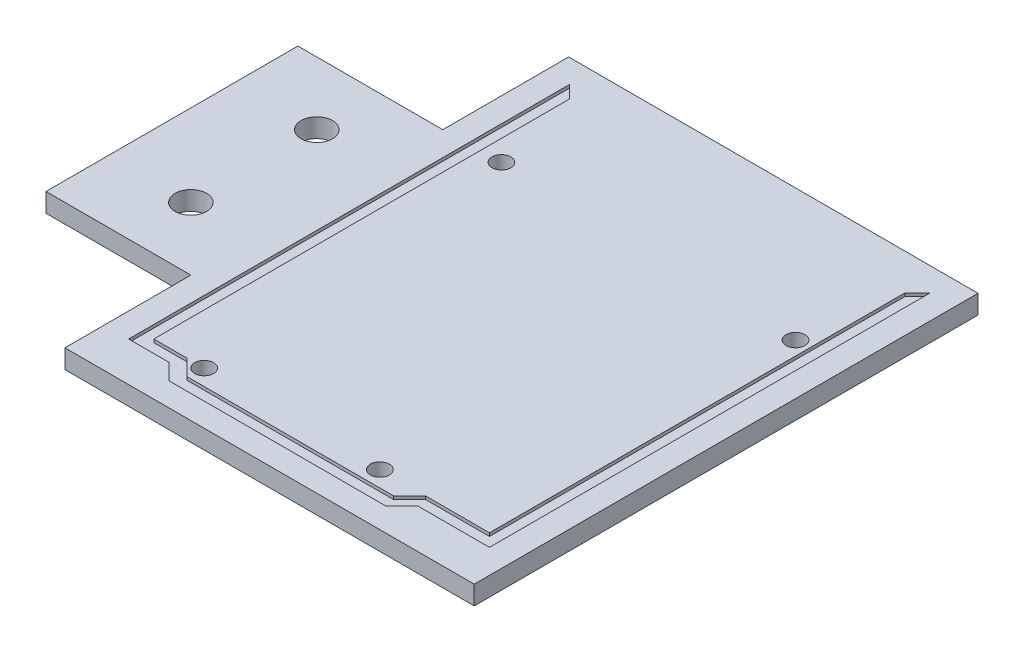
ISO-10303-21;
HEADER;
FILE_DESCRIPTION(('STEP AP214'),'2;1');
FILE_NAME('part.step','',(''),(''),'','','');
FILE_SCHEMA(('AUTOMOTIVE_DESIGN { 1 0 10303 214 1 1 1 1 }'));
ENDSEC;
DATA;
#1=APPLICATION_CONTEXT('core data for automotive mechanical design processes');
#2=APPLICATION_PROTOCOL_DEFINITION('international standard','automotive_design',2000,#1);
#3=PRODUCT_CONTEXT('',#1,'mechanical');
#4=PRODUCT('Part','Part','',(#3));
#5=PRODUCT_RELATED_PRODUCT_CATEGORY('part','',(#4));
#6=PRODUCT_DEFINITION_FORMATION('','',#4);
#7=PRODUCT_DEFINITION_CONTEXT('part definition',#1,'design');
#8=PRODUCT_DEFINITION('design','',#6,#7);
#9=PRODUCT_DEFINITION_SHAPE('','',#8);
#10=(LENGTH_UNIT() NAMED_UNIT(*) SI_UNIT(.MILLI.,.METRE.));
#11=(NAMED_UNIT(*) PLANE_ANGLE_UNIT() SI_UNIT($,.RADIAN.));
#12=(NAMED_UNIT(*) SI_UNIT($,.STERADIAN.) SOLID_ANGLE_UNIT());
#13=UNCERTAINTY_MEASURE_WITH_UNIT(LENGTH_MEASURE(1.E-05),#10,'distance_accuracy_value','');
#14=(GEOMETRIC_REPRESENTATION_CONTEXT(3) GLOBAL_UNCERTAINTY_ASSIGNED_CONTEXT((#13)) GLOBAL_UNIT_ASSIGNED_CONTEXT((#10,
#11,#12)) REPRESENTATION_CONTEXT('',''));
#15=CARTESIAN_POINT('',(0.,0.,0.));
#16=DIRECTION('',(0.,0.,1.));
#17=DIRECTION('',(1.,0.,0.));
#18=AXIS2_PLACEMENT_3D('',#15,#16,#17);
#19=CARTESIAN_POINT('',(23.,20.,40.));
#20=DIRECTION('',(0.,1.,0.));
#21=DIRECTION('',(-1.,0.,0.));
#22=AXIS2_PLACEMENT_3D('',#19,#20,#21);
#23=PLANE('',#22);
#24=CARTESIAN_POINT('',(32.1499999999999,20.,-0.169999999999993));
#25=DIRECTION('',(0.,1.,0.));
#26=DIRECTION('',(-1.,0.,0.));
#27=AXIS2_PLACEMENT_3D('',#24,#25,#26);
#28=CIRCLE('',#27,1.5);
#29=CARTESIAN_POINT('',(30.6499999999999,20.,-0.169999999999993));
#30=VERTEX_POINT('',#29);
#31=EDGE_CURVE('E477',#30,#30,#28,.F.);
#32=ORIENTED_EDGE('',*,*,#31,.F.);
#33=EDGE_LOOP('',(#32));
#34=FACE_BOUND('',#33,.T.);
#35=CARTESIAN_POINT('',(79.9499999999999,20.,0.930000000000007));
#36=DIRECTION('',(0.,1.,0.));
#37=DIRECTION('',(-1.,0.,0.));
#38=AXIS2_PLACEMENT_3D('',#35,#36,#37);
#39=CIRCLE('',#38,1.5);
#40=CARTESIAN_POINT('',(78.4499999999999,20.,0.930000000000007));
#41=VERTEX_POINT('',#40);
#42=EDGE_CURVE('E489',#41,#41,#39,.F.);
#43=ORIENTED_EDGE('',*,*,#42,.F.);
#44=EDGE_LOOP('',(#43));
#45=FACE_BOUND('',#44,.T.);
#46=CARTESIAN_POINT('',(64.7499999999999,20.,51.73));
#47=DIRECTION('',(0.,1.,0.));
#48=DIRECTION('',(-1.,0.,0.));
#49=AXIS2_PLACEMENT_3D('',#46,#47,#48);
#50=CIRCLE('',#49,1.5);
#51=CARTESIAN_POINT('',(63.2499999999999,20.,51.73));
#52=VERTEX_POINT('',#51);
#53=EDGE_CURVE('E497',#52,#52,#50,.F.);
#54=ORIENTED_EDGE('',*,*,#53,.F.);
#55=EDGE_LOOP('',(#54));
#56=FACE_BOUND('',#55,.T.);
#57=CARTESIAN_POINT('',(36.8499999999999,20.,51.73));
#58=DIRECTION('',(0.,1.,0.));
#59=DIRECTION('',(-1.,0.,0.));
#60=AXIS2_PLACEMENT_3D('',#57,#58,#59);
#61=CIRCLE('',#60,1.5);
#62=CARTESIAN_POINT('',(35.3499999999999,20.,51.73));
#63=VERTEX_POINT('',#62);
#64=EDGE_CURVE('E222',#63,#63,#61,.F.);
#65=ORIENTED_EDGE('',*,*,#64,.F.);
#66=EDGE_LOOP('',(#65));
#67=FACE_BOUND('',#66,.T.);
#68=CARTESIAN_POINT('',(13.,20.,10.));
#69=DIRECTION('',(0.,1.,0.));
#70=DIRECTION('',(-1.,0.,0.));
#71=AXIS2_PLACEMENT_3D('',#68,#69,#70);
#72=CIRCLE('',#71,2.5);
#73=CARTESIAN_POINT('',(10.5,20.,10.));
#74=VERTEX_POINT('',#73);
#75=EDGE_CURVE('E237',#74,#74,#72,.F.);
#76=ORIENTED_EDGE('',*,*,#75,.F.);
#77=EDGE_LOOP('',(#76));
#78=FACE_BOUND('',#77,.T.);
#79=CARTESIAN_POINT('',(13.,20.,30.));
#80=DIRECTION('',(0.,1.,0.));
#81=DIRECTION('',(-1.,0.,0.));
#82=AXIS2_PLACEMENT_3D('',#79,#80,#81);
#83=CIRCLE('',#82,2.5);
#84=CARTESIAN_POINT('',(10.5,20.,30.));
#85=VERTEX_POINT('',#84);
#86=EDGE_CURVE('E255',#85,#85,#83,.F.);
#87=ORIENTED_EDGE('',*,*,#86,.F.);
#88=EDGE_LOOP('',(#87));
#89=FACE_BOUND('',#88,.T.);
#90=DIRECTION('',(1.,0.,0.));
#91=VECTOR('',#90,1.);
#92=CARTESIAN_POINT('',(23.,20.,0.));
#93=LINE('',#92,#91);
#94=CARTESIAN_POINT('',(0.,20.,0.));
#95=VERTEX_POINT('',#94);
#96=CARTESIAN_POINT('',(23.,20.,0.));
#97=VERTEX_POINT('',#96);
#98=EDGE_CURVE('E57',#95,#97,#93,.T.);
#99=ORIENTED_EDGE('',*,*,#98,.T.);
#100=DIRECTION('',(0.,0.,-1.));
#101=VECTOR('',#100,1.);
#102=CARTESIAN_POINT('',(23.,20.,60.));
#103=LINE('',#102,#101);
#104=CARTESIAN_POINT('',(23.,20.,-20.));
#105=VERTEX_POINT('',#104);
#106=EDGE_CURVE('E264',#97,#105,#103,.T.);
#107=ORIENTED_EDGE('',*,*,#106,.T.);
#108=DIRECTION('',(1.,0.,0.));
#109=VECTOR('',#108,1.);
#110=CARTESIAN_POINT('',(88.,20.,-20.));
#111=LINE('',#110,#109);
#112=CARTESIAN_POINT('',(88.,20.,-20.));
#113=VERTEX_POINT('',#112);
#114=EDGE_CURVE('E267',#105,#113,#111,.T.);
#115=ORIENTED_EDGE('',*,*,#114,.T.);
#116=DIRECTION('',(0.,0.,1.));
#117=VECTOR('',#116,1.);
#118=CARTESIAN_POINT('',(88.,20.,60.));
#119=LINE('',#118,#117);
#120=CARTESIAN_POINT('',(88.,20.,60.));
#121=VERTEX_POINT('',#120);
#122=EDGE_CURVE('E269',#113,#121,#119,.T.);
#123=ORIENTED_EDGE('',*,*,#122,.T.);
#124=DIRECTION('',(-1.,0.,0.));
#125=VECTOR('',#124,1.);
#126=CARTESIAN_POINT('',(88.,20.,60.));
#127=LINE('',#126,#125);
#128=CARTESIAN_POINT('',(23.,20.,60.));
#129=VERTEX_POINT('',#128);
#130=EDGE_CURVE('E259',#121,#129,#127,.T.);
#131=ORIENTED_EDGE('',*,*,#130,.T.);
#132=CARTESIAN_POINT('',(23.,20.,40.));
#133=VERTEX_POINT('',#132);
#134=EDGE_CURVE('E210',#129,#133,#103,.T.);
#135=ORIENTED_EDGE('',*,*,#134,.T.);
#136=DIRECTION('',(1.,0.,0.));
#137=VECTOR('',#136,1.);
#138=CARTESIAN_POINT('',(23.,20.,40.));
#139=LINE('',#138,#137);
#140=CARTESIAN_POINT('',(0.,20.,40.));
#141=VERTEX_POINT('',#140);
#142=EDGE_CURVE('E205',#141,#133,#139,.T.);
#143=ORIENTED_EDGE('',*,*,#142,.F.);
#144=DIRECTION('',(0.,0.,-1.));
#145=VECTOR('',#144,1.);
#146=CARTESIAN_POINT('',(0.,20.,0.));
#147=LINE('',#146,#145);
#148=EDGE_CURVE('E207',#141,#95,#147,.T.);
#149=ORIENTED_EDGE('',*,*,#148,.T.);
#150=EDGE_LOOP('',(#99,#107,#115,#123,#131,#135,#143,#149));
#151=FACE_BOUND('',#150,.T.);
#152=ADVANCED_FACE('F42',(#34,#45,#56,#67,#78,#89,#151),#23,.F.);
#153=CARTESIAN_POINT('',(0.,23.,40.));
#154=DIRECTION('',(0.,-1.,0.));
#155=DIRECTION('',(0.,0.,-1.));
#156=AXIS2_PLACEMENT_3D('',#153,#154,#155);
#157=PLANE('',#156);
#158=CARTESIAN_POINT('',(32.1499999999999,23.,-0.169999999999993));
#159=DIRECTION('',(0.,1.,0.));
#160=DIRECTION('',(0.,0.,1.));
#161=AXIS2_PLACEMENT_3D('',#158,#159,#160);
#162=CIRCLE('',#161,1.5);
#163=CARTESIAN_POINT('',(32.1499999999999,23.,1.33000000000001));
#164=VERTEX_POINT('',#163);
#165=EDGE_CURVE('E481',#164,#164,#162,.T.);
#166=ORIENTED_EDGE('',*,*,#165,.F.);
#167=EDGE_LOOP('',(#166));
#168=FACE_BOUND('',#167,.T.);
#169=CARTESIAN_POINT('',(79.9499999999999,23.,0.930000000000007));
#170=DIRECTION('',(0.,1.,0.));
#171=DIRECTION('',(0.,0.,1.));
#172=AXIS2_PLACEMENT_3D('',#169,#170,#171);
#173=CIRCLE('',#172,1.5);
#174=CARTESIAN_POINT('',(79.9499999999999,23.,2.43));
#175=VERTEX_POINT('',#174);
#176=EDGE_CURVE('E485',#175,#175,#173,.T.);
#177=ORIENTED_EDGE('',*,*,#176,.F.);
#178=EDGE_LOOP('',(#177));
#179=FACE_BOUND('',#178,.T.);
#180=CARTESIAN_POINT('',(64.7499999999999,23.,51.73));
#181=DIRECTION('',(0.,1.,0.));
#182=DIRECTION('',(0.,0.,1.));
#183=AXIS2_PLACEMENT_3D('',#180,#181,#182);
#184=CIRCLE('',#183,1.5);
#185=CARTESIAN_POINT('',(64.7499999999999,23.,53.23));
#186=VERTEX_POINT('',#185);
#187=EDGE_CURVE('E493',#186,#186,#184,.T.);
#188=ORIENTED_EDGE('',*,*,#187,.F.);
#189=EDGE_LOOP('',(#188));
#190=FACE_BOUND('',#189,.T.);
#191=CARTESIAN_POINT('',(36.8499999999999,23.,51.73));
#192=DIRECTION('',(0.,1.,0.));
#193=DIRECTION('',(0.,0.,1.));
#194=AXIS2_PLACEMENT_3D('',#191,#192,#193);
#195=CIRCLE('',#194,1.5);
#196=CARTESIAN_POINT('',(36.8499999999999,23.,53.23));
#197=VERTEX_POINT('',#196);
#198=EDGE_CURVE('E501',#197,#197,#195,.T.);
#199=ORIENTED_EDGE('',*,*,#198,.F.);
#200=EDGE_LOOP('',(#199));
#201=FACE_BOUND('',#200,.T.);
#202=DIRECTION('',(0.,0.,1.));
#203=VECTOR('',#202,1.);
#204=CARTESIAN_POINT('',(26.8499999999999,23.,-16.27));
#205=LINE('',#204,#203);
#206=CARTESIAN_POINT('',(26.8499999999999,23.,-16.27));
#207=VERTEX_POINT('',#206);
#208=CARTESIAN_POINT('',(26.8499999999999,23.,53.73));
#209=VERTEX_POINT('',#208);
#210=EDGE_CURVE('E471',#207,#209,#205,.T.);
#211=ORIENTED_EDGE('',*,*,#210,.F.);
#212=DIRECTION('',(-0.707106781186548,0.,-0.707106781186547));
#213=VECTOR('',#212,1.);
#214=CARTESIAN_POINT('',(28.8499999999999,23.,-14.27));
#215=LINE('',#214,#213);
#216=CARTESIAN_POINT('',(28.8499999999999,23.,-14.27));
#217=VERTEX_POINT('',#216);
#218=EDGE_CURVE('E65',#217,#207,#215,.T.);
#219=ORIENTED_EDGE('',*,*,#218,.F.);
#220=DIRECTION('',(0.,0.,-1.));
#221=VECTOR('',#220,1.);
#222=CARTESIAN_POINT('',(28.8499999999999,23.,-14.27));
#223=LINE('',#222,#221);
#224=CARTESIAN_POINT('',(28.8499999999999,23.,51.73));
#225=VERTEX_POINT('',#224);
#226=EDGE_CURVE('E415',#225,#217,#223,.T.);
#227=ORIENTED_EDGE('',*,*,#226,.F.);
#228=DIRECTION('',(-1.,0.,0.));
#229=VECTOR('',#228,1.);
#230=CARTESIAN_POINT('',(28.8499999999999,23.,51.73));
#231=LINE('',#230,#229);
#232=CARTESIAN_POINT('',(34.1099999999999,23.,51.73));
#233=VERTEX_POINT('',#232);
#234=EDGE_CURVE('E419',#233,#225,#231,.T.);
#235=ORIENTED_EDGE('',*,*,#234,.F.);
#236=DIRECTION('',(-0.707106781186548,0.,-0.707106781186548));
#237=VECTOR('',#236,1.);
#238=CARTESIAN_POINT('',(34.1099999999999,23.,51.73));
#239=LINE('',#238,#237);
#240=CARTESIAN_POINT('',(36.6499999999999,23.,54.27));
#241=VERTEX_POINT('',#240);
#242=EDGE_CURVE('E423',#241,#233,#239,.T.);
#243=ORIENTED_EDGE('',*,*,#242,.F.);
#244=DIRECTION('',(-1.,0.,0.));
#245=VECTOR('',#244,1.);
#246=CARTESIAN_POINT('',(36.6499999999999,23.,54.27));
#247=LINE('',#246,#245);
#248=CARTESIAN_POINT('',(69.4499999999999,23.,54.27));
#249=VERTEX_POINT('',#248);
#250=EDGE_CURVE('E427',#249,#241,#247,.T.);
#251=ORIENTED_EDGE('',*,*,#250,.F.);
#252=DIRECTION('',(-0.707106781186547,0.,0.707106781186548));
#253=VECTOR('',#252,1.);
#254=CARTESIAN_POINT('',(69.4499999999999,23.,54.27));
#255=LINE('',#254,#253);
#256=CARTESIAN_POINT('',(71.9899999999999,23.,51.73));
#257=VERTEX_POINT('',#256);
#258=EDGE_CURVE('E431',#257,#249,#255,.T.);
#259=ORIENTED_EDGE('',*,*,#258,.F.);
#260=DIRECTION('',(-1.,0.,0.));
#261=VECTOR('',#260,1.);
#262=CARTESIAN_POINT('',(71.9899999999999,23.,51.73));
#263=LINE('',#262,#261);
#264=CARTESIAN_POINT('',(82.1499999999999,23.,51.73));
#265=VERTEX_POINT('',#264);
#266=EDGE_CURVE('E435',#265,#257,#263,.T.);
#267=ORIENTED_EDGE('',*,*,#266,.F.);
#268=DIRECTION('',(0.,0.,1.));
#269=VECTOR('',#268,1.);
#270=CARTESIAN_POINT('',(82.1499999999999,23.,51.73));
#271=LINE('',#270,#269);
#272=CARTESIAN_POINT('',(82.1499999999999,23.,-14.27));
#273=VERTEX_POINT('',#272);
#274=EDGE_CURVE('E439',#273,#265,#271,.T.);
#275=ORIENTED_EDGE('',*,*,#274,.F.);
#276=DIRECTION('',(-0.707106781186547,0.,0.707106781186547));
#277=VECTOR('',#276,1.);
#278=CARTESIAN_POINT('',(82.1499999999999,23.,-14.27));
#279=LINE('',#278,#277);
#280=CARTESIAN_POINT('',(84.1499999999999,23.,-16.27));
#281=VERTEX_POINT('',#280);
#282=EDGE_CURVE('E443',#281,#273,#279,.T.);
#283=ORIENTED_EDGE('',*,*,#282,.F.);
#284=DIRECTION('',(0.,0.,-1.));
#285=VECTOR('',#284,1.);
#286=CARTESIAN_POINT('',(84.1499999999999,23.,53.73));
#287=LINE('',#286,#285);
#288=CARTESIAN_POINT('',(84.1499999999999,23.,53.73));
#289=VERTEX_POINT('',#288);
#290=EDGE_CURVE('E447',#289,#281,#287,.T.);
#291=ORIENTED_EDGE('',*,*,#290,.F.);
#292=DIRECTION('',(1.,0.,0.));
#293=VECTOR('',#292,1.);
#294=CARTESIAN_POINT('',(72.8184271247461,23.,53.73));
#295=LINE('',#294,#293);
#296=CARTESIAN_POINT('',(72.8184271247461,23.,53.73));
#297=VERTEX_POINT('',#296);
#298=EDGE_CURVE('E451',#297,#289,#295,.T.);
#299=ORIENTED_EDGE('',*,*,#298,.F.);
#300=DIRECTION('',(0.707106781186548,0.,-0.707106781186548));
#301=VECTOR('',#300,1.);
#302=CARTESIAN_POINT('',(70.2784271247461,23.,56.27));
#303=LINE('',#302,#301);
#304=CARTESIAN_POINT('',(70.2784271247461,23.,56.27));
#305=VERTEX_POINT('',#304);
#306=EDGE_CURVE('E455',#305,#297,#303,.T.);
#307=ORIENTED_EDGE('',*,*,#306,.F.);
#308=DIRECTION('',(1.,0.,0.));
#309=VECTOR('',#308,1.);
#310=CARTESIAN_POINT('',(35.8215728752537,23.,56.27));
#311=LINE('',#310,#309);
#312=CARTESIAN_POINT('',(35.8215728752537,23.,56.27));
#313=VERTEX_POINT('',#312);
#314=EDGE_CURVE('E459',#313,#305,#311,.T.);
#315=ORIENTED_EDGE('',*,*,#314,.F.);
#316=DIRECTION('',(0.707106781186548,0.,0.707106781186548));
#317=VECTOR('',#316,1.);
#318=CARTESIAN_POINT('',(33.2815728752537,23.,53.73));
#319=LINE('',#318,#317);
#320=CARTESIAN_POINT('',(33.2815728752537,23.,53.73));
#321=VERTEX_POINT('',#320);
#322=EDGE_CURVE('E463',#321,#313,#319,.T.);
#323=ORIENTED_EDGE('',*,*,#322,.F.);
#324=DIRECTION('',(1.,0.,0.));
#325=VECTOR('',#324,1.);
#326=CARTESIAN_POINT('',(26.8499999999999,23.,53.73));
#327=LINE('',#326,#325);
#328=EDGE_CURVE('E467',#209,#321,#327,.T.);
#329=ORIENTED_EDGE('',*,*,#328,.F.);
#330=EDGE_LOOP('',(#211,#219,#227,#235,#243,#251,#259,#267,#275,#283,#291,#299,#307,#315,#323,#329));
#331=FACE_BOUND('',#330,.T.);
#332=CARTESIAN_POINT('',(13.,23.,10.));
#333=DIRECTION('',(0.,1.,0.));
#334=DIRECTION('',(0.,0.,1.));
#335=AXIS2_PLACEMENT_3D('',#332,#333,#334);
#336=CIRCLE('',#335,2.5);
#337=CARTESIAN_POINT('',(13.,23.,12.5));
#338=VERTEX_POINT('',#337);
#339=EDGE_CURVE('E247',#338,#338,#336,.T.);
#340=ORIENTED_EDGE('',*,*,#339,.F.);
#341=EDGE_LOOP('',(#340));
#342=FACE_BOUND('',#341,.T.);
#343=CARTESIAN_POINT('',(13.,23.,30.));
#344=DIRECTION('',(0.,1.,0.));
#345=DIRECTION('',(0.,0.,1.));
#346=AXIS2_PLACEMENT_3D('',#343,#344,#345);
#347=CIRCLE('',#346,2.5);
#348=CARTESIAN_POINT('',(13.,23.,32.5));
#349=VERTEX_POINT('',#348);
#350=EDGE_CURVE('E251',#349,#349,#347,.T.);
#351=ORIENTED_EDGE('',*,*,#350,.F.);
#352=EDGE_LOOP('',(#351));
#353=FACE_BOUND('',#352,.T.);
#354=DIRECTION('',(-1.,0.,0.));
#355=VECTOR('',#354,1.);
#356=CARTESIAN_POINT('',(0.,23.,0.));
#357=LINE('',#356,#355);
#358=CARTESIAN_POINT('',(23.,23.,0.));
#359=VERTEX_POINT('',#358);
#360=CARTESIAN_POINT('',(0.,23.,0.));
#361=VERTEX_POINT('',#360);
#362=EDGE_CURVE('E240',#359,#361,#357,.T.);
#363=ORIENTED_EDGE('',*,*,#362,.T.);
#364=DIRECTION('',(0.,0.,-1.));
#365=VECTOR('',#364,1.);
#366=CARTESIAN_POINT('',(0.,23.,40.));
#367=LINE('',#366,#365);
#368=CARTESIAN_POINT('',(0.,23.,40.));
#369=VERTEX_POINT('',#368);
#370=EDGE_CURVE('E11',#369,#361,#367,.T.);
#371=ORIENTED_EDGE('',*,*,#370,.F.);
#372=DIRECTION('',(-1.,0.,0.));
#373=VECTOR('',#372,1.);
#374=CARTESIAN_POINT('',(0.,23.,40.));
#375=LINE('',#374,#373);
#376=CARTESIAN_POINT('',(23.,23.,40.));
#377=VERTEX_POINT('',#376);
#378=EDGE_CURVE('E226',#377,#369,#375,.T.);
#379=ORIENTED_EDGE('',*,*,#378,.F.);
#380=DIRECTION('',(0.,0.,1.));
#381=VECTOR('',#380,1.);
#382=CARTESIAN_POINT('',(23.,23.,60.));
#383=LINE('',#382,#381);
#384=CARTESIAN_POINT('',(23.,23.,60.));
#385=VERTEX_POINT('',#384);
#386=EDGE_CURVE('E301',#377,#385,#383,.T.);
#387=ORIENTED_EDGE('',*,*,#386,.T.);
#388=DIRECTION('',(1.,0.,0.));
#389=VECTOR('',#388,1.);
#390=CARTESIAN_POINT('',(88.,23.,60.));
#391=LINE('',#390,#389);
#392=CARTESIAN_POINT('',(88.,23.,60.));
#393=VERTEX_POINT('',#392);
#394=EDGE_CURVE('E293',#385,#393,#391,.T.);
#395=ORIENTED_EDGE('',*,*,#394,.T.);
#396=DIRECTION('',(0.,0.,-1.));
#397=VECTOR('',#396,1.);
#398=CARTESIAN_POINT('',(88.,23.,60.));
#399=LINE('',#398,#397);
#400=CARTESIAN_POINT('',(88.,23.,-20.));
#401=VERTEX_POINT('',#400);
#402=EDGE_CURVE('E289',#393,#401,#399,.T.);
#403=ORIENTED_EDGE('',*,*,#402,.T.);
#404=DIRECTION('',(-1.,0.,0.));
#405=VECTOR('',#404,1.);
#406=CARTESIAN_POINT('',(88.,23.,-20.));
#407=LINE('',#406,#405);
#408=CARTESIAN_POINT('',(23.,23.,-20.));
#409=VERTEX_POINT('',#408);
#410=EDGE_CURVE('E285',#401,#409,#407,.T.);
#411=ORIENTED_EDGE('',*,*,#410,.T.);
#412=EDGE_CURVE('E297',#409,#359,#383,.T.);
#413=ORIENTED_EDGE('',*,*,#412,.T.);
#414=EDGE_LOOP('',(#363,#371,#379,#387,#395,#403,#411,#413));
#415=FACE_BOUND('',#414,.T.);
#416=ADVANCED_FACE('F512',(#168,#179,#190,#201,#331,#342,#353,#415),#157,.F.);
#417=CARTESIAN_POINT('',(0.,0.,40.));
#418=DIRECTION('',(1.,0.,0.));
#419=DIRECTION('',(0.,0.,-1.));
#420=AXIS2_PLACEMENT_3D('',#417,#418,#419);
#421=PLANE('',#420);
#422=DIRECTION('',(0.,-1.,0.));
#423=VECTOR('',#422,1.);
#424=CARTESIAN_POINT('',(0.,0.,0.));
#425=LINE('',#424,#423);
#426=EDGE_CURVE('E216',#361,#95,#425,.T.);
#427=ORIENTED_EDGE('',*,*,#426,.T.);
#428=ORIENTED_EDGE('',*,*,#148,.F.);
#429=DIRECTION('',(0.,-1.,0.));
#430=VECTOR('',#429,1.);
#431=CARTESIAN_POINT('',(0.,0.,40.));
#432=LINE('',#431,#430);
#433=EDGE_CURVE('E50',#369,#141,#432,.T.);
#434=ORIENTED_EDGE('',*,*,#433,.F.);
#435=ORIENTED_EDGE('',*,*,#370,.T.);
#436=EDGE_LOOP('',(#427,#428,#434,#435));
#437=FACE_BOUND('',#436,.T.);
#438=ADVANCED_FACE('F220',(#437),#421,.F.);
#439=CARTESIAN_POINT('',(0.,0.,40.));
#440=DIRECTION('',(0.,0.,-1.));
#441=DIRECTION('',(-1.,0.,0.));
#442=AXIS2_PLACEMENT_3D('',#439,#440,#441);
#443=PLANE('',#442);
#444=ORIENTED_EDGE('',*,*,#433,.T.);
#445=ORIENTED_EDGE('',*,*,#142,.T.);
#446=DIRECTION('',(0.,1.,0.));
#447=VECTOR('',#446,1.);
#448=CARTESIAN_POINT('',(23.,23.,40.));
#449=LINE('',#448,#447);
#450=EDGE_CURVE('E215',#133,#377,#449,.T.);
#451=ORIENTED_EDGE('',*,*,#450,.T.);
#452=ORIENTED_EDGE('',*,*,#378,.T.);
#453=EDGE_LOOP('',(#444,#445,#451,#452));
#454=FACE_BOUND('',#453,.T.);
#455=ADVANCED_FACE('F224',(#454),#443,.F.);
#456=CARTESIAN_POINT('',(0.,0.,0.));
#457=DIRECTION('',(0.,0.,-1.));
#458=DIRECTION('',(-1.,0.,0.));
#459=AXIS2_PLACEMENT_3D('',#456,#457,#458);
#460=PLANE('',#459);
#461=ORIENTED_EDGE('',*,*,#98,.F.);
#462=ORIENTED_EDGE('',*,*,#426,.F.);
#463=ORIENTED_EDGE('',*,*,#362,.F.);
#464=DIRECTION('',(0.,1.,0.));
#465=VECTOR('',#464,1.);
#466=CARTESIAN_POINT('',(23.,23.,0.));
#467=LINE('',#466,#465);
#468=EDGE_CURVE('E236',#97,#359,#467,.T.);
#469=ORIENTED_EDGE('',*,*,#468,.F.);
#470=EDGE_LOOP('',(#461,#462,#463,#469));
#471=FACE_BOUND('',#470,.T.);
#472=ADVANCED_FACE('F514',(#471),#460,.T.);
#473=CARTESIAN_POINT('',(13.,-0.001000000000001,30.));
#474=DIRECTION('',(0.,1.,0.));
#475=DIRECTION('',(0.,0.,1.));
#476=AXIS2_PLACEMENT_3D('',#473,#474,#475);
#477=CYLINDRICAL_SURFACE('',#476,2.5);
#478=ORIENTED_EDGE('',*,*,#350,.T.);
#479=EDGE_LOOP('',(#478));
#480=FACE_BOUND('',#479,.T.);
#481=ORIENTED_EDGE('',*,*,#86,.T.);
#482=EDGE_LOOP('',(#481));
#483=FACE_BOUND('',#482,.T.);
#484=ADVANCED_FACE('F543',(#480,#483),#477,.F.);
#485=CARTESIAN_POINT('',(13.,-0.001000000000001,10.));
#486=DIRECTION('',(0.,1.,0.));
#487=DIRECTION('',(0.,0.,1.));
#488=AXIS2_PLACEMENT_3D('',#485,#486,#487);
#489=CYLINDRICAL_SURFACE('',#488,2.5);
#490=ORIENTED_EDGE('',*,*,#339,.T.);
#491=EDGE_LOOP('',(#490));
#492=FACE_BOUND('',#491,.T.);
#493=ORIENTED_EDGE('',*,*,#75,.T.);
#494=EDGE_LOOP('',(#493));
#495=FACE_BOUND('',#494,.T.);
#496=ADVANCED_FACE('F536',(#492,#495),#489,.F.);
#497=CARTESIAN_POINT('',(23.,-83.0776406404415,60.));
#498=DIRECTION('',(-1.,0.,0.));
#499=DIRECTION('',(0.,0.,1.));
#500=AXIS2_PLACEMENT_3D('',#497,#498,#499);
#501=PLANE('',#500);
#502=ORIENTED_EDGE('',*,*,#450,.F.);
#503=ORIENTED_EDGE('',*,*,#134,.F.);
#504=DIRECTION('',(0.,1.,0.));
#505=VECTOR('',#504,1.);
#506=CARTESIAN_POINT('',(23.,-83.0776406404415,60.));
#507=LINE('',#506,#505);
#508=EDGE_CURVE('E281',#129,#385,#507,.T.);
#509=ORIENTED_EDGE('',*,*,#508,.T.);
#510=ORIENTED_EDGE('',*,*,#386,.F.);
#511=EDGE_LOOP('',(#502,#503,#509,#510));
#512=FACE_BOUND('',#511,.T.);
#513=ADVANCED_FACE('F534',(#512),#501,.T.);
#514=ORIENTED_EDGE('',*,*,#106,.F.);
#515=ORIENTED_EDGE('',*,*,#468,.T.);
#516=ORIENTED_EDGE('',*,*,#412,.F.);
#517=DIRECTION('',(0.,1.,0.));
#518=VECTOR('',#517,1.);
#519=CARTESIAN_POINT('',(23.,-83.0776406404415,-20.));
#520=LINE('',#519,#518);
#521=EDGE_CURVE('E272',#105,#409,#520,.T.);
#522=ORIENTED_EDGE('',*,*,#521,.F.);
#523=EDGE_LOOP('',(#514,#515,#516,#522));
#524=FACE_BOUND('',#523,.T.);
#525=ADVANCED_FACE('F517',(#524),#501,.T.);
#526=CARTESIAN_POINT('',(88.,-83.0776406404415,-20.));
#527=DIRECTION('',(0.,0.,-1.));
#528=DIRECTION('',(-1.,0.,0.));
#529=AXIS2_PLACEMENT_3D('',#526,#527,#528);
#530=PLANE('',#529);
#531=ORIENTED_EDGE('',*,*,#114,.F.);
#532=ORIENTED_EDGE('',*,*,#521,.T.);
#533=ORIENTED_EDGE('',*,*,#410,.F.);
#534=DIRECTION('',(0.,1.,0.));
#535=VECTOR('',#534,1.);
#536=CARTESIAN_POINT('',(88.,-83.0776406404415,-20.));
#537=LINE('',#536,#535);
#538=EDGE_CURVE('E275',#113,#401,#537,.T.);
#539=ORIENTED_EDGE('',*,*,#538,.F.);
#540=EDGE_LOOP('',(#531,#532,#533,#539));
#541=FACE_BOUND('',#540,.T.);
#542=ADVANCED_FACE('F524',(#541),#530,.T.);
#543=CARTESIAN_POINT('',(88.,-83.0776406404415,60.));
#544=DIRECTION('',(1.,0.,0.));
#545=DIRECTION('',(0.,0.,-1.));
#546=AXIS2_PLACEMENT_3D('',#543,#544,#545);
#547=PLANE('',#546);
#548=ORIENTED_EDGE('',*,*,#122,.F.);
#549=ORIENTED_EDGE('',*,*,#538,.T.);
#550=ORIENTED_EDGE('',*,*,#402,.F.);
#551=DIRECTION('',(0.,1.,0.));
#552=VECTOR('',#551,1.);
#553=CARTESIAN_POINT('',(88.,-83.0776406404415,60.));
#554=LINE('',#553,#552);
#555=EDGE_CURVE('E278',#121,#393,#554,.T.);
#556=ORIENTED_EDGE('',*,*,#555,.F.);
#557=EDGE_LOOP('',(#548,#549,#550,#556));
#558=FACE_BOUND('',#557,.T.);
#559=ADVANCED_FACE('F528',(#558),#547,.T.);
#560=CARTESIAN_POINT('',(88.,-83.0776406404415,60.));
#561=DIRECTION('',(0.,0.,1.));
#562=DIRECTION('',(1.,0.,0.));
#563=AXIS2_PLACEMENT_3D('',#560,#561,#562);
#564=PLANE('',#563);
#565=ORIENTED_EDGE('',*,*,#130,.F.);
#566=ORIENTED_EDGE('',*,*,#555,.T.);
#567=ORIENTED_EDGE('',*,*,#394,.F.);
#568=ORIENTED_EDGE('',*,*,#508,.F.);
#569=EDGE_LOOP('',(#565,#566,#567,#568));
#570=FACE_BOUND('',#569,.T.);
#571=ADVANCED_FACE('F533',(#570),#564,.T.);
#572=CARTESIAN_POINT('',(28.8499999999999,22.5,-14.27));
#573=DIRECTION('',(0.707106781186547,0.,-0.707106781186548));
#574=DIRECTION('',(-0.707106781186548,0.,-0.707106781186547));
#575=AXIS2_PLACEMENT_3D('',#572,#573,#574);
#576=PLANE('',#575);
#577=ORIENTED_EDGE('',*,*,#218,.T.);
#578=DIRECTION('',(0.,1.,0.));
#579=VECTOR('',#578,1.);
#580=CARTESIAN_POINT('',(26.8499999999999,22.5,-16.27));
#581=LINE('',#580,#579);
#582=CARTESIAN_POINT('',(26.8499999999999,22.5,-16.27));
#583=VERTEX_POINT('',#582);
#584=EDGE_CURVE('E348',#583,#207,#581,.T.);
#585=ORIENTED_EDGE('',*,*,#584,.F.);
#586=DIRECTION('',(-0.707106781186548,0.,-0.707106781186547));
#587=VECTOR('',#586,1.);
#588=CARTESIAN_POINT('',(28.8499999999999,22.5,-14.27));
#589=LINE('',#588,#587);
#590=CARTESIAN_POINT('',(28.8499999999999,22.5,-14.27));
#591=VERTEX_POINT('',#590);
#592=EDGE_CURVE('E411',#591,#583,#589,.T.);
#593=ORIENTED_EDGE('',*,*,#592,.F.);
#594=DIRECTION('',(0.,1.,0.));
#595=VECTOR('',#594,1.);
#596=CARTESIAN_POINT('',(28.8499999999999,22.5,-14.27));
#597=LINE('',#596,#595);
#598=EDGE_CURVE('E304',#591,#217,#597,.T.);
#599=ORIENTED_EDGE('',*,*,#598,.T.);
#600=EDGE_LOOP('',(#577,#585,#593,#599));
#601=FACE_BOUND('',#600,.T.);
#602=ADVANCED_FACE('F667',(#601),#576,.F.);
#603=CARTESIAN_POINT('',(28.8499999999999,22.5,-14.27));
#604=DIRECTION('',(1.,0.,0.));
#605=DIRECTION('',(0.,0.,-1.));
#606=AXIS2_PLACEMENT_3D('',#603,#604,#605);
#607=PLANE('',#606);
#608=ORIENTED_EDGE('',*,*,#226,.T.);
#609=ORIENTED_EDGE('',*,*,#598,.F.);
#610=DIRECTION('',(0.,0.,-1.));
#611=VECTOR('',#610,1.);
#612=CARTESIAN_POINT('',(28.8499999999999,22.5,-14.27));
#613=LINE('',#612,#611);
#614=CARTESIAN_POINT('',(28.8499999999999,22.5,51.73));
#615=VERTEX_POINT('',#614);
#616=EDGE_CURVE('E351',#615,#591,#613,.T.);
#617=ORIENTED_EDGE('',*,*,#616,.F.);
#618=DIRECTION('',(0.,1.,0.));
#619=VECTOR('',#618,1.);
#620=CARTESIAN_POINT('',(28.8499999999999,22.5,51.73));
#621=LINE('',#620,#619);
#622=EDGE_CURVE('E306',#615,#225,#621,.T.);
#623=ORIENTED_EDGE('',*,*,#622,.T.);
#624=EDGE_LOOP('',(#608,#609,#617,#623));
#625=FACE_BOUND('',#624,.T.);
#626=ADVANCED_FACE('F676',(#625),#607,.F.);
#627=CARTESIAN_POINT('',(28.8499999999999,22.5,51.73));
#628=DIRECTION('',(0.,0.,-1.));
#629=DIRECTION('',(-1.,0.,0.));
#630=AXIS2_PLACEMENT_3D('',#627,#628,#629);
#631=PLANE('',#630);
#632=ORIENTED_EDGE('',*,*,#234,.T.);
#633=ORIENTED_EDGE('',*,*,#622,.F.);
#634=DIRECTION('',(-1.,0.,0.));
#635=VECTOR('',#634,1.);
#636=CARTESIAN_POINT('',(28.8499999999999,22.5,51.73));
#637=LINE('',#636,#635);
#638=CARTESIAN_POINT('',(34.1099999999999,22.5,51.73));
#639=VERTEX_POINT('',#638);
#640=EDGE_CURVE('E355',#639,#615,#637,.T.);
#641=ORIENTED_EDGE('',*,*,#640,.F.);
#642=DIRECTION('',(0.,1.,0.));
#643=VECTOR('',#642,1.);
#644=CARTESIAN_POINT('',(34.1099999999999,22.5,51.73));
#645=LINE('',#644,#643);
#646=EDGE_CURVE('E309',#639,#233,#645,.T.);
#647=ORIENTED_EDGE('',*,*,#646,.T.);
#648=EDGE_LOOP('',(#632,#633,#641,#647));
#649=FACE_BOUND('',#648,.T.);
#650=ADVANCED_FACE('F686',(#649),#631,.F.);
#651=CARTESIAN_POINT('',(34.1099999999999,22.5,51.73));
#652=DIRECTION('',(0.707106781186547,0.,-0.707106781186547));
#653=DIRECTION('',(-0.707106781186548,0.,-0.707106781186548));
#654=AXIS2_PLACEMENT_3D('',#651,#652,#653);
#655=PLANE('',#654);
#656=ORIENTED_EDGE('',*,*,#242,.T.);
#657=ORIENTED_EDGE('',*,*,#646,.F.);
#658=DIRECTION('',(-0.707106781186548,0.,-0.707106781186548));
#659=VECTOR('',#658,1.);
#660=CARTESIAN_POINT('',(34.1099999999999,22.5,51.73));
#661=LINE('',#660,#659);
#662=CARTESIAN_POINT('',(36.6499999999999,22.5,54.27));
#663=VERTEX_POINT('',#662);
#664=EDGE_CURVE('E359',#663,#639,#661,.T.);
#665=ORIENTED_EDGE('',*,*,#664,.F.);
#666=DIRECTION('',(0.,1.,0.));
#667=VECTOR('',#666,1.);
#668=CARTESIAN_POINT('',(36.6499999999999,22.5,54.27));
#669=LINE('',#668,#667);
#670=EDGE_CURVE('E312',#663,#241,#669,.T.);
#671=ORIENTED_EDGE('',*,*,#670,.T.);
#672=EDGE_LOOP('',(#656,#657,#665,#671));
#673=FACE_BOUND('',#672,.T.);
#674=ADVANCED_FACE('F697',(#673),#655,.F.);
#675=CARTESIAN_POINT('',(36.6499999999999,22.5,54.27));
#676=DIRECTION('',(0.,0.,-1.));
#677=DIRECTION('',(-1.,0.,0.));
#678=AXIS2_PLACEMENT_3D('',#675,#676,#677);
#679=PLANE('',#678);
#680=ORIENTED_EDGE('',*,*,#250,.T.);
#681=ORIENTED_EDGE('',*,*,#670,.F.);
#682=DIRECTION('',(-1.,0.,0.));
#683=VECTOR('',#682,1.);
#684=CARTESIAN_POINT('',(36.6499999999999,22.5,54.27));
#685=LINE('',#684,#683);
#686=CARTESIAN_POINT('',(69.4499999999999,22.5,54.27));
#687=VERTEX_POINT('',#686);
#688=EDGE_CURVE('E363',#687,#663,#685,.T.);
#689=ORIENTED_EDGE('',*,*,#688,.F.);
#690=DIRECTION('',(0.,1.,0.));
#691=VECTOR('',#690,1.);
#692=CARTESIAN_POINT('',(69.4499999999999,22.5,54.27));
#693=LINE('',#692,#691);
#694=EDGE_CURVE('E315',#687,#249,#693,.T.);
#695=ORIENTED_EDGE('',*,*,#694,.T.);
#696=EDGE_LOOP('',(#680,#681,#689,#695));
#697=FACE_BOUND('',#696,.T.);
#698=ADVANCED_FACE('F708',(#697),#679,.F.);
#699=CARTESIAN_POINT('',(69.4499999999999,22.5,54.27));
#700=DIRECTION('',(-0.707106781186548,0.,-0.707106781186547));
#701=DIRECTION('',(-0.707106781186547,0.,0.707106781186548));
#702=AXIS2_PLACEMENT_3D('',#699,#700,#701);
#703=PLANE('',#702);
#704=ORIENTED_EDGE('',*,*,#258,.T.);
#705=ORIENTED_EDGE('',*,*,#694,.F.);
#706=DIRECTION('',(-0.707106781186547,0.,0.707106781186548));
#707=VECTOR('',#706,1.);
#708=CARTESIAN_POINT('',(69.4499999999999,22.5,54.27));
#709=LINE('',#708,#707);
#710=CARTESIAN_POINT('',(71.9899999999999,22.5,51.73));
#711=VERTEX_POINT('',#710);
#712=EDGE_CURVE('E367',#711,#687,#709,.T.);
#713=ORIENTED_EDGE('',*,*,#712,.F.);
#714=DIRECTION('',(0.,1.,0.));
#715=VECTOR('',#714,1.);
#716=CARTESIAN_POINT('',(71.9899999999999,22.5,51.73));
#717=LINE('',#716,#715);
#718=EDGE_CURVE('E318',#711,#257,#717,.T.);
#719=ORIENTED_EDGE('',*,*,#718,.T.);
#720=EDGE_LOOP('',(#704,#705,#713,#719));
#721=FACE_BOUND('',#720,.T.);
#722=ADVANCED_FACE('F719',(#721),#703,.F.);
#723=CARTESIAN_POINT('',(71.9899999999999,22.5,51.73));
#724=DIRECTION('',(0.,0.,-1.));
#725=DIRECTION('',(-1.,0.,0.));
#726=AXIS2_PLACEMENT_3D('',#723,#724,#725);
#727=PLANE('',#726);
#728=ORIENTED_EDGE('',*,*,#266,.T.);
#729=ORIENTED_EDGE('',*,*,#718,.F.);
#730=DIRECTION('',(-1.,0.,0.));
#731=VECTOR('',#730,1.);
#732=CARTESIAN_POINT('',(71.9899999999999,22.5,51.73));
#733=LINE('',#732,#731);
#734=CARTESIAN_POINT('',(82.1499999999999,22.5,51.73));
#735=VERTEX_POINT('',#734);
#736=EDGE_CURVE('E371',#735,#711,#733,.T.);
#737=ORIENTED_EDGE('',*,*,#736,.F.);
#738=DIRECTION('',(0.,1.,0.));
#739=VECTOR('',#738,1.);
#740=CARTESIAN_POINT('',(82.1499999999999,22.5,51.73));
#741=LINE('',#740,#739);
#742=EDGE_CURVE('E321',#735,#265,#741,.T.);
#743=ORIENTED_EDGE('',*,*,#742,.T.);
#744=EDGE_LOOP('',(#728,#729,#737,#743));
#745=FACE_BOUND('',#744,.T.);
#746=ADVANCED_FACE('F730',(#745),#727,.F.);
#747=CARTESIAN_POINT('',(82.1499999999999,22.5,51.73));
#748=DIRECTION('',(-1.,0.,0.));
#749=DIRECTION('',(0.,0.,1.));
#750=AXIS2_PLACEMENT_3D('',#747,#748,#749);
#751=PLANE('',#750);
#752=ORIENTED_EDGE('',*,*,#274,.T.);
#753=ORIENTED_EDGE('',*,*,#742,.F.);
#754=DIRECTION('',(0.,0.,1.));
#755=VECTOR('',#754,1.);
#756=CARTESIAN_POINT('',(82.1499999999999,22.5,51.73));
#757=LINE('',#756,#755);
#758=CARTESIAN_POINT('',(82.1499999999999,22.5,-14.27));
#759=VERTEX_POINT('',#758);
#760=EDGE_CURVE('E375',#759,#735,#757,.T.);
#761=ORIENTED_EDGE('',*,*,#760,.F.);
#762=DIRECTION('',(0.,1.,0.));
#763=VECTOR('',#762,1.);
#764=CARTESIAN_POINT('',(82.1499999999999,22.5,-14.27));
#765=LINE('',#764,#763);
#766=EDGE_CURVE('E324',#759,#273,#765,.T.);
#767=ORIENTED_EDGE('',*,*,#766,.T.);
#768=EDGE_LOOP('',(#752,#753,#761,#767));
#769=FACE_BOUND('',#768,.T.);
#770=ADVANCED_FACE('F741',(#769),#751,.F.);
#771=CARTESIAN_POINT('',(82.1499999999999,22.5,-14.27));
#772=DIRECTION('',(-0.707106781186547,0.,-0.707106781186547));
#773=DIRECTION('',(-0.707106781186548,0.,0.707106781186548));
#774=AXIS2_PLACEMENT_3D('',#771,#772,#773);
#775=PLANE('',#774);
#776=ORIENTED_EDGE('',*,*,#282,.T.);
#777=ORIENTED_EDGE('',*,*,#766,.F.);
#778=DIRECTION('',(-0.707106781186547,0.,0.707106781186547));
#779=VECTOR('',#778,1.);
#780=CARTESIAN_POINT('',(82.1499999999999,22.5,-14.27));
#781=LINE('',#780,#779);
#782=CARTESIAN_POINT('',(84.1499999999999,22.5,-16.27));
#783=VERTEX_POINT('',#782);
#784=EDGE_CURVE('E379',#783,#759,#781,.T.);
#785=ORIENTED_EDGE('',*,*,#784,.F.);
#786=DIRECTION('',(0.,1.,0.));
#787=VECTOR('',#786,1.);
#788=CARTESIAN_POINT('',(84.1499999999999,22.5,-16.27));
#789=LINE('',#788,#787);
#790=EDGE_CURVE('E327',#783,#281,#789,.T.);
#791=ORIENTED_EDGE('',*,*,#790,.T.);
#792=EDGE_LOOP('',(#776,#777,#785,#791));
#793=FACE_BOUND('',#792,.T.);
#794=ADVANCED_FACE('F752',(#793),#775,.F.);
#795=CARTESIAN_POINT('',(84.1499999999999,22.5,53.73));
#796=DIRECTION('',(1.,0.,0.));
#797=DIRECTION('',(0.,0.,-1.));
#798=AXIS2_PLACEMENT_3D('',#795,#796,#797);
#799=PLANE('',#798);
#800=ORIENTED_EDGE('',*,*,#290,.T.);
#801=ORIENTED_EDGE('',*,*,#790,.F.);
#802=DIRECTION('',(0.,0.,-1.));
#803=VECTOR('',#802,1.);
#804=CARTESIAN_POINT('',(84.1499999999999,22.5,53.73));
#805=LINE('',#804,#803);
#806=CARTESIAN_POINT('',(84.1499999999999,22.5,53.73));
#807=VERTEX_POINT('',#806);
#808=EDGE_CURVE('E383',#807,#783,#805,.T.);
#809=ORIENTED_EDGE('',*,*,#808,.F.);
#810=DIRECTION('',(0.,1.,0.));
#811=VECTOR('',#810,1.);
#812=CARTESIAN_POINT('',(84.1499999999999,22.5,53.73));
#813=LINE('',#812,#811);
#814=EDGE_CURVE('E330',#807,#289,#813,.T.);
#815=ORIENTED_EDGE('',*,*,#814,.T.);
#816=EDGE_LOOP('',(#800,#801,#809,#815));
#817=FACE_BOUND('',#816,.T.);
#818=ADVANCED_FACE('F763',(#817),#799,.F.);
#819=CARTESIAN_POINT('',(72.8184271247461,22.5,53.73));
#820=DIRECTION('',(0.,0.,1.));
#821=DIRECTION('',(1.,0.,0.));
#822=AXIS2_PLACEMENT_3D('',#819,#820,#821);
#823=PLANE('',#822);
#824=ORIENTED_EDGE('',*,*,#298,.T.);
#825=ORIENTED_EDGE('',*,*,#814,.F.);
#826=DIRECTION('',(1.,0.,0.));
#827=VECTOR('',#826,1.);
#828=CARTESIAN_POINT('',(72.8184271247461,22.5,53.73));
#829=LINE('',#828,#827);
#830=CARTESIAN_POINT('',(72.8184271247461,22.5,53.73));
#831=VERTEX_POINT('',#830);
#832=EDGE_CURVE('E387',#831,#807,#829,.T.);
#833=ORIENTED_EDGE('',*,*,#832,.F.);
#834=DIRECTION('',(0.,1.,0.));
#835=VECTOR('',#834,1.);
#836=CARTESIAN_POINT('',(72.8184271247461,22.5,53.73));
#837=LINE('',#836,#835);
#838=EDGE_CURVE('E333',#831,#297,#837,.T.);
#839=ORIENTED_EDGE('',*,*,#838,.T.);
#840=EDGE_LOOP('',(#824,#825,#833,#839));
#841=FACE_BOUND('',#840,.T.);
#842=ADVANCED_FACE('F774',(#841),#823,.F.);
#843=CARTESIAN_POINT('',(70.2784271247461,22.5,56.27));
#844=DIRECTION('',(0.707106781186547,0.,0.707106781186547));
#845=DIRECTION('',(0.707106781186548,0.,-0.707106781186548));
#846=AXIS2_PLACEMENT_3D('',#843,#844,#845);
#847=PLANE('',#846);
#848=ORIENTED_EDGE('',*,*,#306,.T.);
#849=ORIENTED_EDGE('',*,*,#838,.F.);
#850=DIRECTION('',(0.707106781186548,0.,-0.707106781186548));
#851=VECTOR('',#850,1.);
#852=CARTESIAN_POINT('',(70.2784271247461,22.5,56.27));
#853=LINE('',#852,#851);
#854=CARTESIAN_POINT('',(70.2784271247461,22.5,56.27));
#855=VERTEX_POINT('',#854);
#856=EDGE_CURVE('E391',#855,#831,#853,.T.);
#857=ORIENTED_EDGE('',*,*,#856,.F.);
#858=DIRECTION('',(0.,1.,0.));
#859=VECTOR('',#858,1.);
#860=CARTESIAN_POINT('',(70.2784271247461,22.5,56.27));
#861=LINE('',#860,#859);
#862=EDGE_CURVE('E336',#855,#305,#861,.T.);
#863=ORIENTED_EDGE('',*,*,#862,.T.);
#864=EDGE_LOOP('',(#848,#849,#857,#863));
#865=FACE_BOUND('',#864,.T.);
#866=ADVANCED_FACE('F785',(#865),#847,.F.);
#867=CARTESIAN_POINT('',(35.8215728752537,22.5,56.27));
#868=DIRECTION('',(0.,0.,1.));
#869=DIRECTION('',(1.,0.,0.));
#870=AXIS2_PLACEMENT_3D('',#867,#868,#869);
#871=PLANE('',#870);
#872=ORIENTED_EDGE('',*,*,#314,.T.);
#873=ORIENTED_EDGE('',*,*,#862,.F.);
#874=DIRECTION('',(1.,0.,0.));
#875=VECTOR('',#874,1.);
#876=CARTESIAN_POINT('',(35.8215728752537,22.5,56.27));
#877=LINE('',#876,#875);
#878=CARTESIAN_POINT('',(35.8215728752537,22.5,56.27));
#879=VERTEX_POINT('',#878);
#880=EDGE_CURVE('E395',#879,#855,#877,.T.);
#881=ORIENTED_EDGE('',*,*,#880,.F.);
#882=DIRECTION('',(0.,1.,0.));
#883=VECTOR('',#882,1.);
#884=CARTESIAN_POINT('',(35.8215728752537,22.5,56.27));
#885=LINE('',#884,#883);
#886=EDGE_CURVE('E339',#879,#313,#885,.T.);
#887=ORIENTED_EDGE('',*,*,#886,.T.);
#888=EDGE_LOOP('',(#872,#873,#881,#887));
#889=FACE_BOUND('',#888,.T.);
#890=ADVANCED_FACE('F796',(#889),#871,.F.);
#891=CARTESIAN_POINT('',(33.2815728752537,22.5,53.73));
#892=DIRECTION('',(-0.707106781186547,0.,0.707106781186547));
#893=DIRECTION('',(0.707106781186548,0.,0.707106781186548));
#894=AXIS2_PLACEMENT_3D('',#891,#892,#893);
#895=PLANE('',#894);
#896=ORIENTED_EDGE('',*,*,#322,.T.);
#897=ORIENTED_EDGE('',*,*,#886,.F.);
#898=DIRECTION('',(0.707106781186548,0.,0.707106781186548));
#899=VECTOR('',#898,1.);
#900=CARTESIAN_POINT('',(33.2815728752537,22.5,53.73));
#901=LINE('',#900,#899);
#902=CARTESIAN_POINT('',(33.2815728752537,22.5,53.73));
#903=VERTEX_POINT('',#902);
#904=EDGE_CURVE('E399',#903,#879,#901,.T.);
#905=ORIENTED_EDGE('',*,*,#904,.F.);
#906=DIRECTION('',(0.,1.,0.));
#907=VECTOR('',#906,1.);
#908=CARTESIAN_POINT('',(33.2815728752537,22.5,53.73));
#909=LINE('',#908,#907);
#910=EDGE_CURVE('E342',#903,#321,#909,.T.);
#911=ORIENTED_EDGE('',*,*,#910,.T.);
#912=EDGE_LOOP('',(#896,#897,#905,#911));
#913=FACE_BOUND('',#912,.T.);
#914=ADVANCED_FACE('F807',(#913),#895,.F.);
#915=CARTESIAN_POINT('',(26.8499999999999,22.5,53.73));
#916=DIRECTION('',(0.,0.,1.));
#917=DIRECTION('',(1.,0.,0.));
#918=AXIS2_PLACEMENT_3D('',#915,#916,#917);
#919=PLANE('',#918);
#920=ORIENTED_EDGE('',*,*,#328,.T.);
#921=ORIENTED_EDGE('',*,*,#910,.F.);
#922=DIRECTION('',(1.,0.,0.));
#923=VECTOR('',#922,1.);
#924=CARTESIAN_POINT('',(26.8499999999999,22.5,53.73));
#925=LINE('',#924,#923);
#926=CARTESIAN_POINT('',(26.8499999999999,22.5,53.73));
#927=VERTEX_POINT('',#926);
#928=EDGE_CURVE('E403',#927,#903,#925,.T.);
#929=ORIENTED_EDGE('',*,*,#928,.F.);
#930=DIRECTION('',(0.,1.,0.));
#931=VECTOR('',#930,1.);
#932=CARTESIAN_POINT('',(26.8499999999999,22.5,53.73));
#933=LINE('',#932,#931);
#934=EDGE_CURVE('E345',#927,#209,#933,.T.);
#935=ORIENTED_EDGE('',*,*,#934,.T.);
#936=EDGE_LOOP('',(#920,#921,#929,#935));
#937=FACE_BOUND('',#936,.T.);
#938=ADVANCED_FACE('F818',(#937),#919,.F.);
#939=CARTESIAN_POINT('',(26.8499999999999,22.5,-16.27));
#940=DIRECTION('',(-1.,0.,0.));
#941=DIRECTION('',(0.,0.,1.));
#942=AXIS2_PLACEMENT_3D('',#939,#940,#941);
#943=PLANE('',#942);
#944=ORIENTED_EDGE('',*,*,#210,.T.);
#945=ORIENTED_EDGE('',*,*,#934,.F.);
#946=DIRECTION('',(0.,0.,1.));
#947=VECTOR('',#946,1.);
#948=CARTESIAN_POINT('',(26.8499999999999,22.5,-16.27));
#949=LINE('',#948,#947);
#950=EDGE_CURVE('E407',#583,#927,#949,.T.);
#951=ORIENTED_EDGE('',*,*,#950,.F.);
#952=ORIENTED_EDGE('',*,*,#584,.T.);
#953=EDGE_LOOP('',(#944,#945,#951,#952));
#954=FACE_BOUND('',#953,.T.);
#955=ADVANCED_FACE('F829',(#954),#943,.F.);
#956=CARTESIAN_POINT('',(0.,22.5,0.));
#957=DIRECTION('',(0.,-1.,0.));
#958=DIRECTION('',(0.,0.,-1.));
#959=AXIS2_PLACEMENT_3D('',#956,#957,#958);
#960=PLANE('',#959);
#961=ORIENTED_EDGE('',*,*,#592,.T.);
#962=ORIENTED_EDGE('',*,*,#950,.T.);
#963=ORIENTED_EDGE('',*,*,#928,.T.);
#964=ORIENTED_EDGE('',*,*,#904,.T.);
#965=ORIENTED_EDGE('',*,*,#880,.T.);
#966=ORIENTED_EDGE('',*,*,#856,.T.);
#967=ORIENTED_EDGE('',*,*,#832,.T.);
#968=ORIENTED_EDGE('',*,*,#808,.T.);
#969=ORIENTED_EDGE('',*,*,#784,.T.);
#970=ORIENTED_EDGE('',*,*,#760,.T.);
#971=ORIENTED_EDGE('',*,*,#736,.T.);
#972=ORIENTED_EDGE('',*,*,#712,.T.);
#973=ORIENTED_EDGE('',*,*,#688,.T.);
#974=ORIENTED_EDGE('',*,*,#664,.T.);
#975=ORIENTED_EDGE('',*,*,#640,.T.);
#976=ORIENTED_EDGE('',*,*,#616,.T.);
#977=EDGE_LOOP('',(#961,#962,#963,#964,#965,#966,#967,#968,#969,#970,#971,#972,#973,#974,#975,#976));
#978=FACE_BOUND('',#977,.T.);
#979=ADVANCED_FACE('F840',(#978),#960,.F.);
#980=CARTESIAN_POINT('',(36.8499999999999,-0.001000000000001,51.73));
#981=DIRECTION('',(0.,1.,0.));
#982=DIRECTION('',(0.,0.,1.));
#983=AXIS2_PLACEMENT_3D('',#980,#981,#982);
#984=CYLINDRICAL_SURFACE('',#983,1.5);
#985=ORIENTED_EDGE('',*,*,#198,.T.);
#986=EDGE_LOOP('',(#985));
#987=FACE_BOUND('',#986,.T.);
#988=ORIENTED_EDGE('',*,*,#64,.T.);
#989=EDGE_LOOP('',(#988));
#990=FACE_BOUND('',#989,.T.);
#991=ADVANCED_FACE('F851',(#987,#990),#984,.F.);
#992=CARTESIAN_POINT('',(64.7499999999999,-0.001000000000001,51.73));
#993=DIRECTION('',(0.,1.,0.));
#994=DIRECTION('',(0.,0.,1.));
#995=AXIS2_PLACEMENT_3D('',#992,#993,#994);
#996=CYLINDRICAL_SURFACE('',#995,1.5);
#997=ORIENTED_EDGE('',*,*,#187,.T.);
#998=EDGE_LOOP('',(#997));
#999=FACE_BOUND('',#998,.T.);
#1000=ORIENTED_EDGE('',*,*,#53,.T.);
#1001=EDGE_LOOP('',(#1000));
#1002=FACE_BOUND('',#1001,.T.);
#1003=ADVANCED_FACE('F862',(#999,#1002),#996,.F.);
#1004=CARTESIAN_POINT('',(79.9499999999999,-0.001000000000001,0.930000000000007));
#1005=DIRECTION('',(0.,1.,0.));
#1006=DIRECTION('',(0.,0.,1.));
#1007=AXIS2_PLACEMENT_3D('',#1004,#1005,#1006);
#1008=CYLINDRICAL_SURFACE('',#1007,1.5);
#1009=ORIENTED_EDGE('',*,*,#176,.T.);
#1010=EDGE_LOOP('',(#1009));
#1011=FACE_BOUND('',#1010,.T.);
#1012=ORIENTED_EDGE('',*,*,#42,.T.);
#1013=EDGE_LOOP('',(#1012));
#1014=FACE_BOUND('',#1013,.T.);
#1015=ADVANCED_FACE('F873',(#1011,#1014),#1008,.F.);
#1016=CARTESIAN_POINT('',(32.1499999999999,-0.001000000000001,-0.169999999999993));
#1017=DIRECTION('',(0.,1.,0.));
#1018=DIRECTION('',(0.,0.,1.));
#1019=AXIS2_PLACEMENT_3D('',#1016,#1017,#1018);
#1020=CYLINDRICAL_SURFACE('',#1019,1.5);
#1021=ORIENTED_EDGE('',*,*,#165,.T.);
#1022=EDGE_LOOP('',(#1021));
#1023=FACE_BOUND('',#1022,.T.);
#1024=ORIENTED_EDGE('',*,*,#31,.T.);
#1025=EDGE_LOOP('',(#1024));
#1026=FACE_BOUND('',#1025,.T.);
#1027=ADVANCED_FACE('F883',(#1023,#1026),#1020,.F.);
#1028=CLOSED_SHELL('',(#152,#416,#438,#455,#472,#484,#496,#513,#525,#542,#559,#571,#602,#626,
#650,#674,#698,#722,#746,#770,#794,#818,#842,#866,#890,#914,#938,#955,#979,#991,#1003,#1015,#1027));
#1029=MANIFOLD_SOLID_BREP('B2',#1028);
#1030=ADVANCED_BREP_SHAPE_REPRESENTATION('',(#18,#1029),#14);
#1031=SHAPE_DEFINITION_REPRESENTATION(#9,#1030);
ENDSEC;
END-ISO-10303-21;
